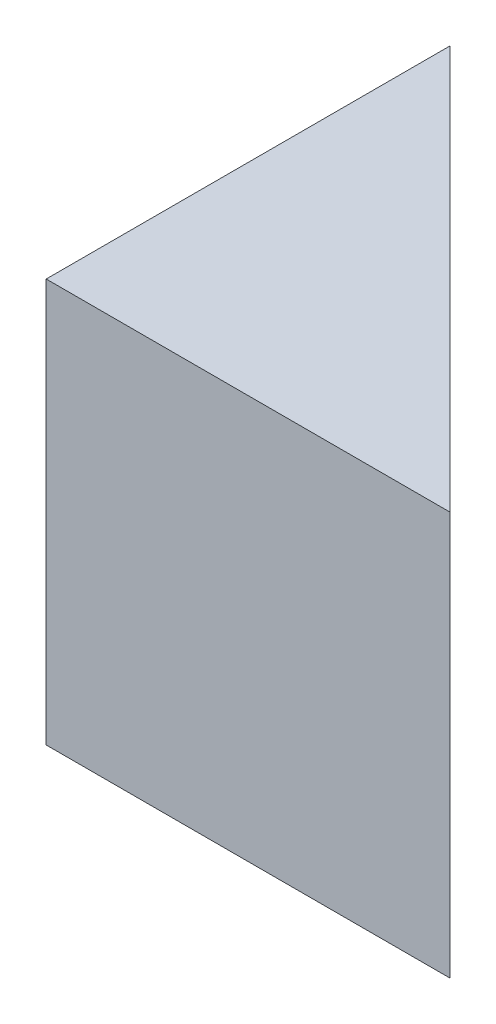
ISO-10303-21;
HEADER;
FILE_DESCRIPTION(('STEP AP214'),'2;1');
FILE_NAME('part.step','',(''),(''),'','','');
FILE_SCHEMA(('AUTOMOTIVE_DESIGN { 1 0 10303 214 1 1 1 1 }'));
ENDSEC;
DATA;
#1=APPLICATION_CONTEXT('core data for automotive mechanical design processes');
#2=APPLICATION_PROTOCOL_DEFINITION('international standard','automotive_design',2000,#1);
#3=PRODUCT_CONTEXT('',#1,'mechanical');
#4=PRODUCT('Part','Part','',(#3));
#5=PRODUCT_RELATED_PRODUCT_CATEGORY('part','',(#4));
#6=PRODUCT_DEFINITION_FORMATION('','',#4);
#7=PRODUCT_DEFINITION_CONTEXT('part definition',#1,'design');
#8=PRODUCT_DEFINITION('design','',#6,#7);
#9=PRODUCT_DEFINITION_SHAPE('','',#8);
#10=(LENGTH_UNIT() NAMED_UNIT(*) SI_UNIT(.MILLI.,.METRE.));
#11=(NAMED_UNIT(*) PLANE_ANGLE_UNIT() SI_UNIT($,.RADIAN.));
#12=(NAMED_UNIT(*) SI_UNIT($,.STERADIAN.) SOLID_ANGLE_UNIT());
#13=UNCERTAINTY_MEASURE_WITH_UNIT(LENGTH_MEASURE(1.E-05),#10,'distance_accuracy_value','');
#14=(GEOMETRIC_REPRESENTATION_CONTEXT(3) GLOBAL_UNCERTAINTY_ASSIGNED_CONTEXT((#13)) GLOBAL_UNIT_ASSIGNED_CONTEXT((#10,
#11,#12)) REPRESENTATION_CONTEXT('',''));
#15=CARTESIAN_POINT('',(0.,0.,0.));
#16=DIRECTION('',(0.,0.,1.));
#17=DIRECTION('',(1.,0.,0.));
#18=AXIS2_PLACEMENT_3D('',#15,#16,#17);
#19=CARTESIAN_POINT('',(-7.5,15.,-7.5));
#20=DIRECTION('',(1.,0.,0.));
#21=DIRECTION('',(0.,0.,-1.));
#22=AXIS2_PLACEMENT_3D('',#19,#20,#21);
#23=PLANE('',#22);
#24=DIRECTION('',(0.,0.,1.));
#25=VECTOR('',#24,1.);
#26=CARTESIAN_POINT('',(-7.5,0.,-7.5));
#27=LINE('',#26,#25);
#28=CARTESIAN_POINT('',(-7.5,0.,-7.5));
#29=VERTEX_POINT('',#28);
#30=CARTESIAN_POINT('',(-7.5,0.,7.5));
#31=VERTEX_POINT('',#30);
#32=EDGE_CURVE('E63',#29,#31,#27,.T.);
#33=ORIENTED_EDGE('',*,*,#32,.T.);
#34=DIRECTION('',(0.,-1.,0.));
#35=VECTOR('',#34,1.);
#36=CARTESIAN_POINT('',(-7.5,15.,7.5));
#37=LINE('',#36,#35);
#38=CARTESIAN_POINT('',(-7.5,15.,7.5));
#39=VERTEX_POINT('',#38);
#40=EDGE_CURVE('E46',#39,#31,#37,.T.);
#41=ORIENTED_EDGE('',*,*,#40,.F.);
#42=DIRECTION('',(0.,0.,1.));
#43=VECTOR('',#42,1.);
#44=CARTESIAN_POINT('',(-7.5,15.,-7.5));
#45=LINE('',#44,#43);
#46=CARTESIAN_POINT('',(-7.5,15.,-7.5));
#47=VERTEX_POINT('',#46);
#48=EDGE_CURVE('E53',#47,#39,#45,.T.);
#49=ORIENTED_EDGE('',*,*,#48,.F.);
#50=DIRECTION('',(0.,-1.,0.));
#51=VECTOR('',#50,1.);
#52=CARTESIAN_POINT('',(-7.5,15.,-7.5));
#53=LINE('',#52,#51);
#54=EDGE_CURVE('E11',#47,#29,#53,.T.);
#55=ORIENTED_EDGE('',*,*,#54,.T.);
#56=EDGE_LOOP('',(#33,#41,#49,#55));
#57=FACE_BOUND('',#56,.T.);
#58=ADVANCED_FACE('F38',(#57),#23,.F.);
#59=CARTESIAN_POINT('',(-7.5,15.,7.5));
#60=DIRECTION('',(0.,0.,-1.));
#61=DIRECTION('',(-1.,0.,0.));
#62=AXIS2_PLACEMENT_3D('',#59,#60,#61);
#63=PLANE('',#62);
#64=DIRECTION('',(1.,0.,0.));
#65=VECTOR('',#64,1.);
#66=CARTESIAN_POINT('',(-7.5,0.,7.5));
#67=LINE('',#66,#65);
#68=CARTESIAN_POINT('',(7.5,0.,7.5));
#69=VERTEX_POINT('',#68);
#70=EDGE_CURVE('E83',#31,#69,#67,.T.);
#71=ORIENTED_EDGE('',*,*,#70,.T.);
#72=DIRECTION('',(0.,-1.,0.));
#73=VECTOR('',#72,1.);
#74=CARTESIAN_POINT('',(7.5,15.,7.5));
#75=LINE('',#74,#73);
#76=CARTESIAN_POINT('',(7.5,15.,7.5));
#77=VERTEX_POINT('',#76);
#78=EDGE_CURVE('E77',#77,#69,#75,.T.);
#79=ORIENTED_EDGE('',*,*,#78,.F.);
#80=DIRECTION('',(1.,0.,0.));
#81=VECTOR('',#80,1.);
#82=CARTESIAN_POINT('',(-7.5,15.,7.5));
#83=LINE('',#82,#81);
#84=EDGE_CURVE('E88',#39,#77,#83,.T.);
#85=ORIENTED_EDGE('',*,*,#84,.F.);
#86=ORIENTED_EDGE('',*,*,#40,.T.);
#87=EDGE_LOOP('',(#71,#79,#85,#86));
#88=FACE_BOUND('',#87,.T.);
#89=ADVANCED_FACE('F93',(#88),#63,.F.);
#90=CARTESIAN_POINT('',(0.,15.,0.));
#91=DIRECTION('',(0.,1.,0.));
#92=DIRECTION('',(0.,0.,1.));
#93=AXIS2_PLACEMENT_3D('',#90,#91,#92);
#94=PLANE('',#93);
#95=DIRECTION('',(0.707106781186548,0.,0.707106781186548));
#96=VECTOR('',#95,1.);
#97=CARTESIAN_POINT('',(0.,15.,0.));
#98=LINE('',#97,#96);
#99=EDGE_CURVE('E71',#47,#77,#98,.T.);
#100=ORIENTED_EDGE('',*,*,#99,.F.);
#101=ORIENTED_EDGE('',*,*,#48,.T.);
#102=ORIENTED_EDGE('',*,*,#84,.T.);
#103=EDGE_LOOP('',(#100,#101,#102));
#104=FACE_BOUND('',#103,.T.);
#105=ADVANCED_FACE('F94',(#104),#94,.T.);
#106=CARTESIAN_POINT('',(0.,0.,0.));
#107=DIRECTION('',(0.,1.,0.));
#108=DIRECTION('',(0.,0.,1.));
#109=AXIS2_PLACEMENT_3D('',#106,#107,#108);
#110=PLANE('',#109);
#111=ORIENTED_EDGE('',*,*,#32,.F.);
#112=DIRECTION('',(0.707106781186547,0.,0.707106781186547));
#113=VECTOR('',#112,1.);
#114=CARTESIAN_POINT('',(-7.5,0.,-7.5));
#115=LINE('',#114,#113);
#116=EDGE_CURVE('E74',#29,#69,#115,.T.);
#117=ORIENTED_EDGE('',*,*,#116,.T.);
#118=ORIENTED_EDGE('',*,*,#70,.F.);
#119=EDGE_LOOP('',(#111,#117,#118));
#120=FACE_BOUND('',#119,.T.);
#121=ADVANCED_FACE('F82',(#120),#110,.F.);
#122=CARTESIAN_POINT('',(-7.5,0.,-7.5));
#123=DIRECTION('',(-0.707106781186547,0.,0.707106781186547));
#124=DIRECTION('',(0.707106781186548,0.,0.707106781186548));
#125=AXIS2_PLACEMENT_3D('',#122,#123,#124);
#126=PLANE('',#125);
#127=ORIENTED_EDGE('',*,*,#99,.T.);
#128=ORIENTED_EDGE('',*,*,#78,.T.);
#129=ORIENTED_EDGE('',*,*,#116,.F.);
#130=ORIENTED_EDGE('',*,*,#54,.F.);
#131=EDGE_LOOP('',(#127,#128,#129,#130));
#132=FACE_BOUND('',#131,.T.);
#133=ADVANCED_FACE('F75',(#132),#126,.F.);
#134=CLOSED_SHELL('',(#58,#89,#105,#121,#133));
#135=MANIFOLD_SOLID_BREP('B2',#134);
#136=ADVANCED_BREP_SHAPE_REPRESENTATION('',(#18,#135),#14);
#137=SHAPE_DEFINITION_REPRESENTATION(#9,#136);
ENDSEC;
END-ISO-10303-21;
